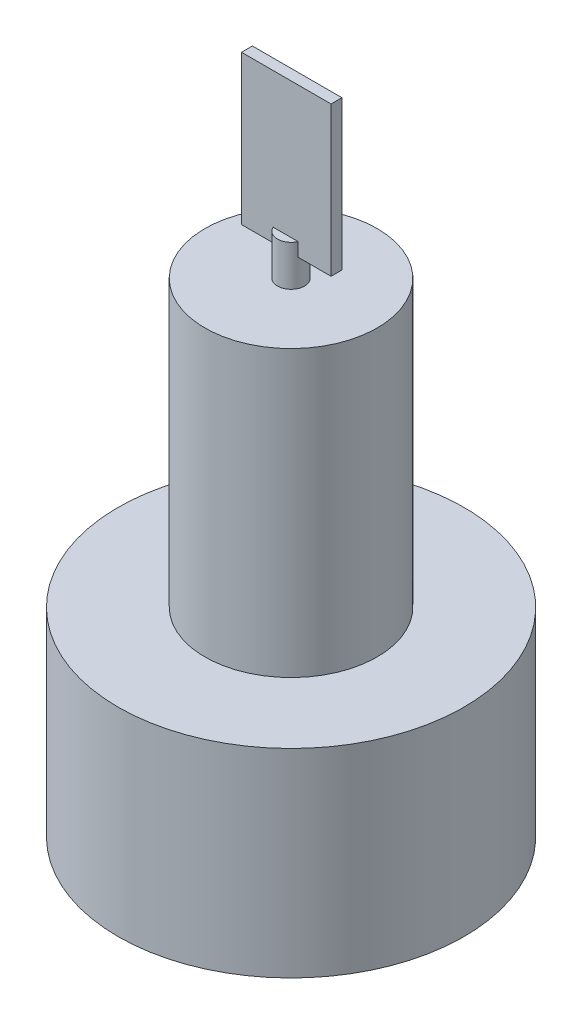
ISO-10303-21;
HEADER;
FILE_DESCRIPTION(('STEP AP214'),'2;1');
FILE_NAME('part.step','',(''),(''),'','','');
FILE_SCHEMA(('AUTOMOTIVE_DESIGN { 1 0 10303 214 1 1 1 1 }'));
ENDSEC;
DATA;
#1=APPLICATION_CONTEXT('core data for automotive mechanical design processes');
#2=APPLICATION_PROTOCOL_DEFINITION('international standard','automotive_design',2000,#1);
#3=PRODUCT_CONTEXT('',#1,'mechanical');
#4=PRODUCT('Part','Part','',(#3));
#5=PRODUCT_RELATED_PRODUCT_CATEGORY('part','',(#4));
#6=PRODUCT_DEFINITION_FORMATION('','',#4);
#7=PRODUCT_DEFINITION_CONTEXT('part definition',#1,'design');
#8=PRODUCT_DEFINITION('design','',#6,#7);
#9=PRODUCT_DEFINITION_SHAPE('','',#8);
#10=(LENGTH_UNIT() NAMED_UNIT(*) SI_UNIT(.MILLI.,.METRE.));
#11=(NAMED_UNIT(*) PLANE_ANGLE_UNIT() SI_UNIT($,.RADIAN.));
#12=(NAMED_UNIT(*) SI_UNIT($,.STERADIAN.) SOLID_ANGLE_UNIT());
#13=UNCERTAINTY_MEASURE_WITH_UNIT(LENGTH_MEASURE(1.E-05),#10,'distance_accuracy_value','');
#14=(GEOMETRIC_REPRESENTATION_CONTEXT(3) GLOBAL_UNCERTAINTY_ASSIGNED_CONTEXT((#13)) GLOBAL_UNIT_ASSIGNED_CONTEXT((#10,
#11,#12)) REPRESENTATION_CONTEXT('',''));
#15=CARTESIAN_POINT('',(0.,0.,0.));
#16=DIRECTION('',(0.,0.,1.));
#17=DIRECTION('',(1.,0.,0.));
#18=AXIS2_PLACEMENT_3D('',#15,#16,#17);
#19=CARTESIAN_POINT('',(0.,38.65,0.));
#20=DIRECTION('',(0.,-1.,0.));
#21=DIRECTION('',(0.,0.,-1.));
#22=AXIS2_PLACEMENT_3D('',#19,#20,#21);
#23=CYLINDRICAL_SURFACE('',#22,1.);
#24=CARTESIAN_POINT('',(0.,35.65,0.));
#25=DIRECTION('',(0.,1.,0.));
#26=DIRECTION('',(0.,0.,1.));
#27=AXIS2_PLACEMENT_3D('',#24,#25,#26);
#28=CIRCLE('',#27,1.);
#29=CARTESIAN_POINT('',(0.,35.65,1.));
#30=VERTEX_POINT('',#29);
#31=EDGE_CURVE('E154',#30,#30,#28,.T.);
#32=ORIENTED_EDGE('',*,*,#31,.T.);
#33=EDGE_LOOP('',(#32));
#34=FACE_BOUND('',#33,.T.);
#35=DIRECTION('',(0.,-1.,0.));
#36=VECTOR('',#35,1.);
#37=CARTESIAN_POINT('',(-0.916515138991168,38.65,-0.4));
#38=LINE('',#37,#36);
#39=CARTESIAN_POINT('',(-0.916515138991168,38.65,-0.4));
#40=VERTEX_POINT('',#39);
#41=CARTESIAN_POINT('',(-0.916515138991168,37.65,-0.4));
#42=VERTEX_POINT('',#41);
#43=EDGE_CURVE('E149',#40,#42,#38,.T.);
#44=ORIENTED_EDGE('',*,*,#43,.F.);
#45=CARTESIAN_POINT('',(0.,38.65,0.));
#46=DIRECTION('',(0.,1.,0.));
#47=DIRECTION('',(0.,0.,1.));
#48=AXIS2_PLACEMENT_3D('',#45,#46,#47);
#49=CIRCLE('',#48,1.);
#50=CARTESIAN_POINT('',(0.916515138991168,38.65,-0.4));
#51=VERTEX_POINT('',#50);
#52=EDGE_CURVE('E153',#51,#40,#49,.T.);
#53=ORIENTED_EDGE('',*,*,#52,.F.);
#54=DIRECTION('',(0.,-1.,0.));
#55=VECTOR('',#54,1.);
#56=CARTESIAN_POINT('',(0.916515138991168,38.65,-0.4));
#57=LINE('',#56,#55);
#58=CARTESIAN_POINT('',(0.916515138991168,37.65,-0.4));
#59=VERTEX_POINT('',#58);
#60=EDGE_CURVE('E146',#59,#51,#57,.F.);
#61=ORIENTED_EDGE('',*,*,#60,.F.);
#62=CARTESIAN_POINT('',(0.,37.65,0.));
#63=DIRECTION('',(0.,-1.,0.));
#64=DIRECTION('',(0.,0.,-1.));
#65=AXIS2_PLACEMENT_3D('',#62,#63,#64);
#66=CIRCLE('',#65,1.);
#67=CARTESIAN_POINT('',(0.916515138991168,37.65,0.4));
#68=VERTEX_POINT('',#67);
#69=EDGE_CURVE('E39',#59,#68,#66,.T.);
#70=ORIENTED_EDGE('',*,*,#69,.T.);
#71=DIRECTION('',(0.,-1.,0.));
#72=VECTOR('',#71,1.);
#73=CARTESIAN_POINT('',(0.916515138991168,38.65,0.4));
#74=LINE('',#73,#72);
#75=CARTESIAN_POINT('',(0.916515138991168,38.65,0.4));
#76=VERTEX_POINT('',#75);
#77=EDGE_CURVE('E138',#68,#76,#74,.F.);
#78=ORIENTED_EDGE('',*,*,#77,.T.);
#79=CARTESIAN_POINT('',(-0.916515138991168,38.65,0.4));
#80=VERTEX_POINT('',#79);
#81=EDGE_CURVE('E151',#80,#76,#49,.T.);
#82=ORIENTED_EDGE('',*,*,#81,.F.);
#83=DIRECTION('',(0.,-1.,0.));
#84=VECTOR('',#83,1.);
#85=CARTESIAN_POINT('',(-0.916515138991168,38.65,0.4));
#86=LINE('',#85,#84);
#87=CARTESIAN_POINT('',(-0.916515138991168,37.65,0.4));
#88=VERTEX_POINT('',#87);
#89=EDGE_CURVE('E53',#80,#88,#86,.T.);
#90=ORIENTED_EDGE('',*,*,#89,.T.);
#91=EDGE_CURVE('E11',#88,#42,#66,.T.);
#92=ORIENTED_EDGE('',*,*,#91,.T.);
#93=EDGE_LOOP('',(#44,#53,#61,#70,#78,#82,#90,#92));
#94=FACE_BOUND('',#93,.T.);
#95=ADVANCED_FACE('F35',(#34,#94),#23,.T.);
#96=CARTESIAN_POINT('',(0.,38.65,0.));
#97=DIRECTION('',(0.,1.,0.));
#98=DIRECTION('',(0.,0.,1.));
#99=AXIS2_PLACEMENT_3D('',#96,#97,#98);
#100=PLANE('',#99);
#101=ORIENTED_EDGE('',*,*,#52,.T.);
#102=DIRECTION('',(1.,0.,0.));
#103=VECTOR('',#102,1.);
#104=CARTESIAN_POINT('',(0.,38.65,-0.4));
#105=LINE('',#104,#103);
#106=EDGE_CURVE('E171',#40,#51,#105,.T.);
#107=ORIENTED_EDGE('',*,*,#106,.T.);
#108=EDGE_LOOP('',(#101,#107));
#109=FACE_BOUND('',#108,.T.);
#110=ADVANCED_FACE('F202',(#109),#100,.T.);
#111=CARTESIAN_POINT('',(0.,14.65,0.));
#112=DIRECTION('',(0.,-1.,0.));
#113=DIRECTION('',(0.,0.,-1.));
#114=AXIS2_PLACEMENT_3D('',#111,#112,#113);
#115=CYLINDRICAL_SURFACE('',#114,12.75);
#116=CARTESIAN_POINT('',(0.,14.65,0.));
#117=DIRECTION('',(0.,1.,0.));
#118=DIRECTION('',(0.,0.,1.));
#119=AXIS2_PLACEMENT_3D('',#116,#117,#118);
#120=CIRCLE('',#119,12.75);
#121=CARTESIAN_POINT('',(0.,14.65,12.75));
#122=VERTEX_POINT('',#121);
#123=EDGE_CURVE('E165',#122,#122,#120,.T.);
#124=ORIENTED_EDGE('',*,*,#123,.F.);
#125=EDGE_LOOP('',(#124));
#126=FACE_BOUND('',#125,.T.);
#127=CARTESIAN_POINT('',(0.,0.,0.));
#128=DIRECTION('',(0.,1.,0.));
#129=DIRECTION('',(0.,0.,1.));
#130=AXIS2_PLACEMENT_3D('',#127,#128,#129);
#131=CIRCLE('',#130,12.75);
#132=CARTESIAN_POINT('',(0.,0.,12.75));
#133=VERTEX_POINT('',#132);
#134=EDGE_CURVE('E162',#133,#133,#131,.T.);
#135=ORIENTED_EDGE('',*,*,#134,.T.);
#136=EDGE_LOOP('',(#135));
#137=FACE_BOUND('',#136,.T.);
#138=ADVANCED_FACE('F37',(#126,#137),#115,.T.);
#139=CARTESIAN_POINT('',(0.,14.65,0.));
#140=DIRECTION('',(0.,1.,0.));
#141=DIRECTION('',(0.,0.,1.));
#142=AXIS2_PLACEMENT_3D('',#139,#140,#141);
#143=PLANE('',#142);
#144=CARTESIAN_POINT('',(0.,14.65,0.));
#145=DIRECTION('',(0.,1.,0.));
#146=DIRECTION('',(0.,0.,1.));
#147=AXIS2_PLACEMENT_3D('',#144,#145,#146);
#148=CIRCLE('',#147,6.35);
#149=CARTESIAN_POINT('',(0.,14.65,-6.35));
#150=VERTEX_POINT('',#149);
#151=EDGE_CURVE('E158',#150,#150,#148,.T.);
#152=ORIENTED_EDGE('',*,*,#151,.F.);
#153=EDGE_LOOP('',(#152));
#154=FACE_BOUND('',#153,.T.);
#155=ORIENTED_EDGE('',*,*,#123,.T.);
#156=EDGE_LOOP('',(#155));
#157=FACE_BOUND('',#156,.T.);
#158=ADVANCED_FACE('F220',(#154,#157),#143,.T.);
#159=CARTESIAN_POINT('',(0.,0.,0.));
#160=DIRECTION('',(0.,1.,0.));
#161=DIRECTION('',(0.,0.,1.));
#162=AXIS2_PLACEMENT_3D('',#159,#160,#161);
#163=PLANE('',#162);
#164=ORIENTED_EDGE('',*,*,#134,.F.);
#165=EDGE_LOOP('',(#164));
#166=FACE_BOUND('',#165,.T.);
#167=ADVANCED_FACE('F218',(#166),#163,.F.);
#168=CARTESIAN_POINT('',(0.,35.65,0.));
#169=DIRECTION('',(0.,-1.,0.));
#170=DIRECTION('',(0.,0.,-1.));
#171=AXIS2_PLACEMENT_3D('',#168,#169,#170);
#172=CYLINDRICAL_SURFACE('',#171,6.35);
#173=CARTESIAN_POINT('',(0.,35.65,0.));
#174=DIRECTION('',(0.,1.,0.));
#175=DIRECTION('',(0.,0.,1.));
#176=AXIS2_PLACEMENT_3D('',#173,#174,#175);
#177=CIRCLE('',#176,6.35);
#178=CARTESIAN_POINT('',(0.,35.65,-6.35));
#179=VERTEX_POINT('',#178);
#180=EDGE_CURVE('E159',#179,#179,#177,.T.);
#181=CARTESIAN_POINT('',(0.,35.65,-6.35));
#182=CARTESIAN_POINT('',(0.,35.43125,-6.35));
#183=CARTESIAN_POINT('',(0.,35.2125,-6.35));
#184=CARTESIAN_POINT('',(0.,34.775,-6.35));
#185=CARTESIAN_POINT('',(0.,34.55625,-6.35));
#186=CARTESIAN_POINT('',(0.,34.11875,-6.35));
#187=CARTESIAN_POINT('',(0.,33.9,-6.35));
#188=CARTESIAN_POINT('',(0.,33.4625,-6.35));
#189=CARTESIAN_POINT('',(0.,33.24375,-6.35));
#190=CARTESIAN_POINT('',(0.,32.80625,-6.35));
#191=CARTESIAN_POINT('',(0.,32.5875,-6.35));
#192=CARTESIAN_POINT('',(0.,32.15,-6.35));
#193=CARTESIAN_POINT('',(0.,31.93125,-6.35));
#194=CARTESIAN_POINT('',(0.,31.49375,-6.35));
#195=CARTESIAN_POINT('',(0.,31.275,-6.35));
#196=CARTESIAN_POINT('',(0.,30.8375,-6.35));
#197=CARTESIAN_POINT('',(0.,30.61875,-6.35));
#198=CARTESIAN_POINT('',(0.,30.18125,-6.35));
#199=CARTESIAN_POINT('',(0.,29.9625,-6.35));
#200=CARTESIAN_POINT('',(0.,29.525,-6.35));
#201=CARTESIAN_POINT('',(0.,29.30625,-6.35));
#202=CARTESIAN_POINT('',(0.,28.86875,-6.35));
#203=CARTESIAN_POINT('',(0.,28.65,-6.35));
#204=CARTESIAN_POINT('',(0.,28.2125,-6.35));
#205=CARTESIAN_POINT('',(0.,27.99375,-6.35));
#206=CARTESIAN_POINT('',(0.,27.55625,-6.35));
#207=CARTESIAN_POINT('',(0.,27.3375,-6.35));
#208=CARTESIAN_POINT('',(0.,26.9,-6.35));
#209=CARTESIAN_POINT('',(0.,26.68125,-6.35));
#210=CARTESIAN_POINT('',(0.,26.24375,-6.35));
#211=CARTESIAN_POINT('',(0.,26.025,-6.35));
#212=CARTESIAN_POINT('',(0.,25.5875,-6.35));
#213=CARTESIAN_POINT('',(0.,25.36875,-6.35));
#214=CARTESIAN_POINT('',(0.,24.93125,-6.35));
#215=CARTESIAN_POINT('',(0.,24.7125,-6.35));
#216=CARTESIAN_POINT('',(0.,24.275,-6.35));
#217=CARTESIAN_POINT('',(0.,24.05625,-6.35));
#218=CARTESIAN_POINT('',(0.,23.61875,-6.35));
#219=CARTESIAN_POINT('',(0.,23.4,-6.35));
#220=CARTESIAN_POINT('',(0.,22.9625,-6.35));
#221=CARTESIAN_POINT('',(0.,22.74375,-6.35));
#222=CARTESIAN_POINT('',(0.,22.30625,-6.35));
#223=CARTESIAN_POINT('',(0.,22.0875,-6.35));
#224=CARTESIAN_POINT('',(0.,21.65,-6.35));
#225=CARTESIAN_POINT('',(0.,21.43125,-6.35));
#226=CARTESIAN_POINT('',(0.,20.99375,-6.35));
#227=CARTESIAN_POINT('',(0.,20.775,-6.35));
#228=CARTESIAN_POINT('',(0.,20.3375,-6.35));
#229=CARTESIAN_POINT('',(0.,20.11875,-6.35));
#230=CARTESIAN_POINT('',(0.,19.68125,-6.35));
#231=CARTESIAN_POINT('',(0.,19.4625,-6.35));
#232=CARTESIAN_POINT('',(0.,19.025,-6.35));
#233=CARTESIAN_POINT('',(0.,18.80625,-6.35));
#234=CARTESIAN_POINT('',(0.,18.36875,-6.35));
#235=CARTESIAN_POINT('',(0.,18.15,-6.35));
#236=CARTESIAN_POINT('',(0.,17.7125,-6.35));
#237=CARTESIAN_POINT('',(0.,17.49375,-6.35));
#238=CARTESIAN_POINT('',(0.,17.05625,-6.35));
#239=CARTESIAN_POINT('',(0.,16.8375,-6.35));
#240=CARTESIAN_POINT('',(0.,16.4,-6.35));
#241=CARTESIAN_POINT('',(0.,16.18125,-6.35));
#242=CARTESIAN_POINT('',(0.,15.74375,-6.35));
#243=CARTESIAN_POINT('',(0.,15.525,-6.35));
#244=CARTESIAN_POINT('',(0.,15.0875,-6.35));
#245=CARTESIAN_POINT('',(0.,14.86875,-6.35));
#246=CARTESIAN_POINT('',(0.,14.65,-6.35));
#247=B_SPLINE_CURVE_WITH_KNOTS('',3,(#181,#182,#183,#184,#185,#186,#187,#188,#189,#190,#191,
#192,#193,#194,#195,#196,#197,#198,#199,#200,#201,#202,#203,#204,#205,#206,#207,#208,#209,#210,
#211,#212,#213,#214,#215,#216,#217,#218,#219,#220,#221,#222,#223,#224,#225,#226,#227,#228,#229,
#230,#231,#232,#233,#234,#235,#236,#237,#238,#239,#240,#241,#242,#243,#244,#245,#246),
.UNSPECIFIED.,.F.,.F.,(4,2,2,2,2,2,2,2,2,2,2,2,2,2,2,2,2,2,2,2,2,2,2,2,2,2,2,2,2,2,2,2,4),(0.,
0.656249999999997,1.31249999999999,1.96875,2.625,3.28125,3.9375,4.59375,5.25,5.90624999999999,
6.5625,7.21875,7.87499999999999,8.53125,9.18749999999999,9.84374999999999,10.5,11.15625,11.8125,
12.46875,13.125,13.78125,14.4375,15.09375,15.75,16.40625,17.0625,17.71875,18.375,19.03125,
19.6875,20.34375,21.),.UNSPECIFIED.);
#248=EDGE_CURVE('BSEAM214',#179,#150,#247,.T.);
#249=ORIENTED_EDGE('',*,*,#180,.F.);
#250=ORIENTED_EDGE('',*,*,#151,.T.);
#251=ORIENTED_EDGE('',*,*,#248,.T.);
#252=ORIENTED_EDGE('',*,*,#248,.F.);
#253=EDGE_LOOP('',(#249,#251,#250,#252));
#254=FACE_BOUND('',#253,.T.);
#255=ADVANCED_FACE('F214',(#254),#172,.T.);
#256=CARTESIAN_POINT('',(0.,35.65,0.));
#257=DIRECTION('',(0.,1.,0.));
#258=DIRECTION('',(0.,0.,1.));
#259=AXIS2_PLACEMENT_3D('',#256,#257,#258);
#260=PLANE('',#259);
#261=ORIENTED_EDGE('',*,*,#31,.F.);
#262=EDGE_LOOP('',(#261));
#263=FACE_BOUND('',#262,.T.);
#264=ORIENTED_EDGE('',*,*,#180,.T.);
#265=EDGE_LOOP('',(#264));
#266=FACE_BOUND('',#265,.T.);
#267=ADVANCED_FACE('F211',(#263,#266),#260,.T.);
#268=DIRECTION('',(1.,0.,0.));
#269=VECTOR('',#268,1.);
#270=CARTESIAN_POINT('',(0.,38.65,0.4));
#271=LINE('',#270,#269);
#272=EDGE_CURVE('E157',#80,#76,#271,.T.);
#273=ORIENTED_EDGE('',*,*,#272,.F.);
#274=ORIENTED_EDGE('',*,*,#81,.T.);
#275=EDGE_LOOP('',(#273,#274));
#276=FACE_BOUND('',#275,.T.);
#277=ADVANCED_FACE('F200',(#276),#100,.T.);
#278=CARTESIAN_POINT('',(0.,37.65,-0.4));
#279=DIRECTION('',(0.,-1.,0.));
#280=DIRECTION('',(0.,0.,-1.));
#281=AXIS2_PLACEMENT_3D('',#278,#279,#280);
#282=PLANE('',#281);
#283=ORIENTED_EDGE('',*,*,#69,.F.);
#284=DIRECTION('',(1.,0.,0.));
#285=VECTOR('',#284,1.);
#286=CARTESIAN_POINT('',(0.,37.65,-0.4));
#287=LINE('',#286,#285);
#288=CARTESIAN_POINT('',(3.35,37.65,-0.4));
#289=VERTEX_POINT('',#288);
#290=EDGE_CURVE('E130',#59,#289,#287,.T.);
#291=ORIENTED_EDGE('',*,*,#290,.T.);
#292=DIRECTION('',(0.,0.,1.));
#293=VECTOR('',#292,1.);
#294=CARTESIAN_POINT('',(3.35,37.65,-0.4));
#295=LINE('',#294,#293);
#296=CARTESIAN_POINT('',(3.35,37.65,0.4));
#297=VERTEX_POINT('',#296);
#298=EDGE_CURVE('E139',#289,#297,#295,.T.);
#299=ORIENTED_EDGE('',*,*,#298,.T.);
#300=DIRECTION('',(1.,0.,0.));
#301=VECTOR('',#300,1.);
#302=CARTESIAN_POINT('',(0.,37.65,0.4));
#303=LINE('',#302,#301);
#304=EDGE_CURVE('E116',#68,#297,#303,.T.);
#305=ORIENTED_EDGE('',*,*,#304,.F.);
#306=EDGE_LOOP('',(#283,#291,#299,#305));
#307=FACE_BOUND('',#306,.T.);
#308=ADVANCED_FACE('F181',(#307),#282,.T.);
#309=CARTESIAN_POINT('',(0.,0.,-0.4));
#310=DIRECTION('',(0.,0.,1.));
#311=DIRECTION('',(1.,0.,0.));
#312=AXIS2_PLACEMENT_3D('',#309,#310,#311);
#313=PLANE('',#312);
#314=ORIENTED_EDGE('',*,*,#106,.F.);
#315=ORIENTED_EDGE('',*,*,#43,.T.);
#316=CARTESIAN_POINT('',(-3.25,37.65,-0.4));
#317=VERTEX_POINT('',#316);
#318=EDGE_CURVE('E131',#317,#42,#287,.T.);
#319=ORIENTED_EDGE('',*,*,#318,.F.);
#320=DIRECTION('',(0.,-1.,0.));
#321=VECTOR('',#320,1.);
#322=CARTESIAN_POINT('',(-3.24999999999999,0.,-0.4));
#323=LINE('',#322,#321);
#324=CARTESIAN_POINT('',(-3.25,48.65,-0.4));
#325=VERTEX_POINT('',#324);
#326=EDGE_CURVE('E128',#325,#317,#323,.T.);
#327=ORIENTED_EDGE('',*,*,#326,.F.);
#328=DIRECTION('',(-1.,0.,0.));
#329=VECTOR('',#328,1.);
#330=CARTESIAN_POINT('',(0.,48.65,-0.4));
#331=LINE('',#330,#329);
#332=CARTESIAN_POINT('',(3.35,48.65,-0.4));
#333=VERTEX_POINT('',#332);
#334=EDGE_CURVE('E103',#333,#325,#331,.T.);
#335=ORIENTED_EDGE('',*,*,#334,.F.);
#336=DIRECTION('',(0.,1.,0.));
#337=VECTOR('',#336,1.);
#338=CARTESIAN_POINT('',(3.35,0.,-0.4));
#339=LINE('',#338,#337);
#340=EDGE_CURVE('E108',#289,#333,#339,.T.);
#341=ORIENTED_EDGE('',*,*,#340,.F.);
#342=ORIENTED_EDGE('',*,*,#290,.F.);
#343=ORIENTED_EDGE('',*,*,#60,.T.);
#344=EDGE_LOOP('',(#314,#315,#319,#327,#335,#341,#342,#343));
#345=FACE_BOUND('',#344,.T.);
#346=ADVANCED_FACE('F187',(#345),#313,.F.);
#347=CARTESIAN_POINT('',(0.,0.,0.4));
#348=DIRECTION('',(0.,0.,1.));
#349=DIRECTION('',(1.,0.,0.));
#350=AXIS2_PLACEMENT_3D('',#347,#348,#349);
#351=PLANE('',#350);
#352=ORIENTED_EDGE('',*,*,#89,.F.);
#353=ORIENTED_EDGE('',*,*,#272,.T.);
#354=ORIENTED_EDGE('',*,*,#77,.F.);
#355=ORIENTED_EDGE('',*,*,#304,.T.);
#356=DIRECTION('',(0.,1.,0.));
#357=VECTOR('',#356,1.);
#358=CARTESIAN_POINT('',(3.35,0.,0.4));
#359=LINE('',#358,#357);
#360=CARTESIAN_POINT('',(3.35,48.65,0.4));
#361=VERTEX_POINT('',#360);
#362=EDGE_CURVE('E121',#297,#361,#359,.T.);
#363=ORIENTED_EDGE('',*,*,#362,.T.);
#364=DIRECTION('',(-1.,0.,0.));
#365=VECTOR('',#364,1.);
#366=CARTESIAN_POINT('',(0.,48.65,0.4));
#367=LINE('',#366,#365);
#368=CARTESIAN_POINT('',(-3.25,48.65,0.4));
#369=VERTEX_POINT('',#368);
#370=EDGE_CURVE('E101',#361,#369,#367,.T.);
#371=ORIENTED_EDGE('',*,*,#370,.T.);
#372=DIRECTION('',(0.,-1.,0.));
#373=VECTOR('',#372,1.);
#374=CARTESIAN_POINT('',(-3.24999999999999,0.,0.4));
#375=LINE('',#374,#373);
#376=CARTESIAN_POINT('',(-3.25,37.65,0.4));
#377=VERTEX_POINT('',#376);
#378=EDGE_CURVE('E111',#369,#377,#375,.T.);
#379=ORIENTED_EDGE('',*,*,#378,.T.);
#380=EDGE_CURVE('E124',#377,#88,#303,.T.);
#381=ORIENTED_EDGE('',*,*,#380,.T.);
#382=EDGE_LOOP('',(#352,#353,#354,#355,#363,#371,#379,#381));
#383=FACE_BOUND('',#382,.T.);
#384=ADVANCED_FACE('F119',(#383),#351,.T.);
#385=CARTESIAN_POINT('',(0.,48.65,-0.4));
#386=DIRECTION('',(0.,1.,0.));
#387=DIRECTION('',(0.,0.,1.));
#388=AXIS2_PLACEMENT_3D('',#385,#386,#387);
#389=PLANE('',#388);
#390=DIRECTION('',(0.,0.,1.));
#391=VECTOR('',#390,1.);
#392=CARTESIAN_POINT('',(-3.25,48.65,-0.4));
#393=LINE('',#392,#391);
#394=EDGE_CURVE('E97',#325,#369,#393,.T.);
#395=ORIENTED_EDGE('',*,*,#394,.T.);
#396=ORIENTED_EDGE('',*,*,#370,.F.);
#397=DIRECTION('',(0.,0.,1.));
#398=VECTOR('',#397,1.);
#399=CARTESIAN_POINT('',(3.35,48.65,-0.4));
#400=LINE('',#399,#398);
#401=EDGE_CURVE('E136',#333,#361,#400,.T.);
#402=ORIENTED_EDGE('',*,*,#401,.F.);
#403=ORIENTED_EDGE('',*,*,#334,.T.);
#404=EDGE_LOOP('',(#395,#396,#402,#403));
#405=FACE_BOUND('',#404,.T.);
#406=ADVANCED_FACE('F99',(#405),#389,.T.);
#407=CARTESIAN_POINT('',(3.35,0.,-0.4));
#408=DIRECTION('',(1.,0.,0.));
#409=DIRECTION('',(0.,0.,-1.));
#410=AXIS2_PLACEMENT_3D('',#407,#408,#409);
#411=PLANE('',#410);
#412=ORIENTED_EDGE('',*,*,#401,.T.);
#413=ORIENTED_EDGE('',*,*,#362,.F.);
#414=ORIENTED_EDGE('',*,*,#298,.F.);
#415=ORIENTED_EDGE('',*,*,#340,.T.);
#416=EDGE_LOOP('',(#412,#413,#414,#415));
#417=FACE_BOUND('',#416,.T.);
#418=ADVANCED_FACE('F185',(#417),#411,.T.);
#419=ORIENTED_EDGE('',*,*,#91,.F.);
#420=ORIENTED_EDGE('',*,*,#380,.F.);
#421=DIRECTION('',(0.,0.,1.));
#422=VECTOR('',#421,1.);
#423=CARTESIAN_POINT('',(-3.25,37.65,-0.4));
#424=LINE('',#423,#422);
#425=EDGE_CURVE('E107',#317,#377,#424,.T.);
#426=ORIENTED_EDGE('',*,*,#425,.F.);
#427=ORIENTED_EDGE('',*,*,#318,.T.);
#428=EDGE_LOOP('',(#419,#420,#426,#427));
#429=FACE_BOUND('',#428,.T.);
#430=ADVANCED_FACE('F190',(#429),#282,.T.);
#431=CARTESIAN_POINT('',(-3.24999999999999,0.,-0.4));
#432=DIRECTION('',(-1.,0.,0.));
#433=DIRECTION('',(0.,-1.,0.));
#434=AXIS2_PLACEMENT_3D('',#431,#432,#433);
#435=PLANE('',#434);
#436=ORIENTED_EDGE('',*,*,#425,.T.);
#437=ORIENTED_EDGE('',*,*,#378,.F.);
#438=ORIENTED_EDGE('',*,*,#394,.F.);
#439=ORIENTED_EDGE('',*,*,#326,.T.);
#440=EDGE_LOOP('',(#436,#437,#438,#439));
#441=FACE_BOUND('',#440,.T.);
#442=ADVANCED_FACE('F112',(#441),#435,.T.);
#443=CLOSED_SHELL('',(#95,#110,#138,#158,#167,#255,#267,#277,#308,#346,#384,#406,#418,#430,#442));
#444=MANIFOLD_SOLID_BREP('B2',#443);
#445=ADVANCED_BREP_SHAPE_REPRESENTATION('',(#18,#444),#14);
#446=SHAPE_DEFINITION_REPRESENTATION(#9,#445);
ENDSEC;
END-ISO-10303-21;
